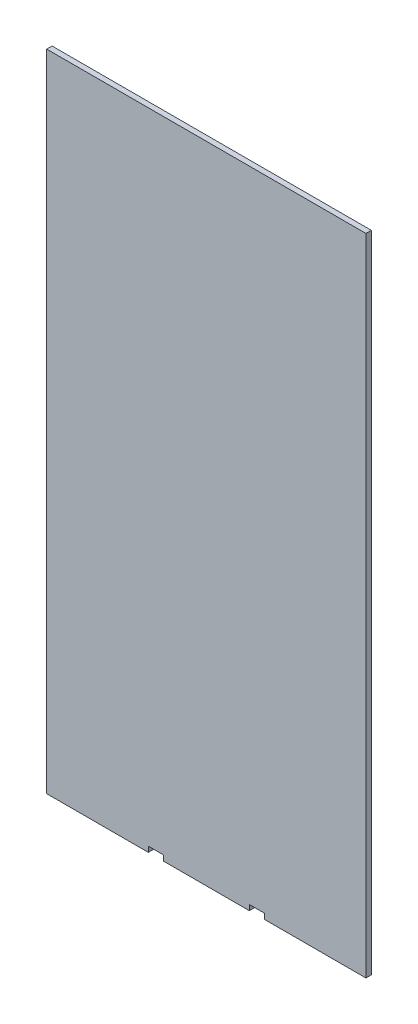
ISO-10303-21;
HEADER;
FILE_DESCRIPTION(('STEP AP214'),'2;1');
FILE_NAME('part.step','',(''),(''),'','','');
FILE_SCHEMA(('AUTOMOTIVE_DESIGN { 1 0 10303 214 1 1 1 1 }'));
ENDSEC;
DATA;
#1=APPLICATION_CONTEXT('core data for automotive mechanical design processes');
#2=APPLICATION_PROTOCOL_DEFINITION('international standard','automotive_design',2000,#1);
#3=PRODUCT_CONTEXT('',#1,'mechanical');
#4=PRODUCT('Part','Part','',(#3));
#5=PRODUCT_RELATED_PRODUCT_CATEGORY('part','',(#4));
#6=PRODUCT_DEFINITION_FORMATION('','',#4);
#7=PRODUCT_DEFINITION_CONTEXT('part definition',#1,'design');
#8=PRODUCT_DEFINITION('design','',#6,#7);
#9=PRODUCT_DEFINITION_SHAPE('','',#8);
#10=(LENGTH_UNIT() NAMED_UNIT(*) SI_UNIT(.MILLI.,.METRE.));
#11=(NAMED_UNIT(*) PLANE_ANGLE_UNIT() SI_UNIT($,.RADIAN.));
#12=(NAMED_UNIT(*) SI_UNIT($,.STERADIAN.) SOLID_ANGLE_UNIT());
#13=UNCERTAINTY_MEASURE_WITH_UNIT(LENGTH_MEASURE(1.E-05),#10,'distance_accuracy_value','');
#14=(GEOMETRIC_REPRESENTATION_CONTEXT(3) GLOBAL_UNCERTAINTY_ASSIGNED_CONTEXT((#13)) GLOBAL_UNIT_ASSIGNED_CONTEXT((#10,
#11,#12)) REPRESENTATION_CONTEXT('',''));
#15=CARTESIAN_POINT('',(0.,0.,0.));
#16=DIRECTION('',(0.,0.,1.));
#17=DIRECTION('',(1.,0.,0.));
#18=AXIS2_PLACEMENT_3D('',#15,#16,#17);
#19=CARTESIAN_POINT('',(-148.5,-607.,-5.));
#20=DIRECTION('',(0.,-1.,0.));
#21=DIRECTION('',(0.,0.,-1.));
#22=AXIS2_PLACEMENT_3D('',#19,#20,#21);
#23=PLANE('',#22);
#24=DIRECTION('',(0.,0.,-1.));
#25=VECTOR('',#24,1.);
#26=CARTESIAN_POINT('',(-40.,-607.,0.00100000000000013));
#27=LINE('',#26,#25);
#28=CARTESIAN_POINT('',(-40.,-607.,0.));
#29=VERTEX_POINT('',#28);
#30=CARTESIAN_POINT('',(-40.,-607.,-5.));
#31=VERTEX_POINT('',#30);
#32=EDGE_CURVE('E122',#29,#31,#27,.T.);
#33=ORIENTED_EDGE('',*,*,#32,.T.);
#34=DIRECTION('',(1.,0.,0.));
#35=VECTOR('',#34,1.);
#36=CARTESIAN_POINT('',(-148.5,-607.,-5.));
#37=LINE('',#36,#35);
#38=CARTESIAN_POINT('',(40.,-607.,-5.));
#39=VERTEX_POINT('',#38);
#40=EDGE_CURVE('E163',#31,#39,#37,.T.);
#41=ORIENTED_EDGE('',*,*,#40,.T.);
#42=DIRECTION('',(0.,0.,-1.));
#43=VECTOR('',#42,1.);
#44=CARTESIAN_POINT('',(40.,-607.,0.00100000000000013));
#45=LINE('',#44,#43);
#46=CARTESIAN_POINT('',(40.,-607.,0.));
#47=VERTEX_POINT('',#46);
#48=EDGE_CURVE('E143',#47,#39,#45,.T.);
#49=ORIENTED_EDGE('',*,*,#48,.F.);
#50=DIRECTION('',(1.,0.,0.));
#51=VECTOR('',#50,1.);
#52=CARTESIAN_POINT('',(-148.5,-607.,0.));
#53=LINE('',#52,#51);
#54=EDGE_CURVE('E137',#29,#47,#53,.T.);
#55=ORIENTED_EDGE('',*,*,#54,.F.);
#56=EDGE_LOOP('',(#33,#41,#49,#55));
#57=FACE_BOUND('',#56,.T.);
#58=ADVANCED_FACE('F31',(#57),#23,.T.);
#59=DIRECTION('',(0.,0.,-1.));
#60=VECTOR('',#59,1.);
#61=CARTESIAN_POINT('',(54.,-607.,0.00100000000000013));
#62=LINE('',#61,#60);
#63=CARTESIAN_POINT('',(54.,-607.,0.));
#64=VERTEX_POINT('',#63);
#65=CARTESIAN_POINT('',(54.,-607.,-5.));
#66=VERTEX_POINT('',#65);
#67=EDGE_CURVE('E183',#64,#66,#62,.T.);
#68=ORIENTED_EDGE('',*,*,#67,.T.);
#69=CARTESIAN_POINT('',(148.5,-607.,-5.));
#70=VERTEX_POINT('',#69);
#71=EDGE_CURVE('E165',#66,#70,#37,.T.);
#72=ORIENTED_EDGE('',*,*,#71,.T.);
#73=DIRECTION('',(0.,0.,1.));
#74=VECTOR('',#73,1.);
#75=CARTESIAN_POINT('',(148.5,-607.,-5.));
#76=LINE('',#75,#74);
#77=CARTESIAN_POINT('',(148.5,-607.,0.));
#78=VERTEX_POINT('',#77);
#79=EDGE_CURVE('E11',#70,#78,#76,.T.);
#80=ORIENTED_EDGE('',*,*,#79,.T.);
#81=EDGE_CURVE('E145',#64,#78,#53,.T.);
#82=ORIENTED_EDGE('',*,*,#81,.F.);
#83=EDGE_LOOP('',(#68,#72,#80,#82));
#84=FACE_BOUND('',#83,.T.);
#85=ADVANCED_FACE('F244',(#84),#23,.T.);
#86=CARTESIAN_POINT('',(148.5,-607.,-5.));
#87=DIRECTION('',(1.,0.,0.));
#88=DIRECTION('',(0.,0.,-1.));
#89=AXIS2_PLACEMENT_3D('',#86,#87,#88);
#90=PLANE('',#89);
#91=DIRECTION('',(0.,1.,0.));
#92=VECTOR('',#91,1.);
#93=CARTESIAN_POINT('',(148.5,-607.,0.));
#94=LINE('',#93,#92);
#95=CARTESIAN_POINT('',(148.5,-7.,0.));
#96=VERTEX_POINT('',#95);
#97=EDGE_CURVE('E191',#78,#96,#94,.T.);
#98=ORIENTED_EDGE('',*,*,#97,.F.);
#99=ORIENTED_EDGE('',*,*,#79,.F.);
#100=DIRECTION('',(0.,1.,0.));
#101=VECTOR('',#100,1.);
#102=CARTESIAN_POINT('',(148.5,-607.,-5.));
#103=LINE('',#102,#101);
#104=CARTESIAN_POINT('',(148.5,-7.,-5.));
#105=VERTEX_POINT('',#104);
#106=EDGE_CURVE('E148',#70,#105,#103,.T.);
#107=ORIENTED_EDGE('',*,*,#106,.T.);
#108=DIRECTION('',(0.,0.,1.));
#109=VECTOR('',#108,1.);
#110=CARTESIAN_POINT('',(148.5,-7.,-5.));
#111=LINE('',#110,#109);
#112=EDGE_CURVE('E35',#105,#96,#111,.T.);
#113=ORIENTED_EDGE('',*,*,#112,.T.);
#114=EDGE_LOOP('',(#98,#99,#107,#113));
#115=FACE_BOUND('',#114,.T.);
#116=ADVANCED_FACE('F33',(#115),#90,.T.);
#117=DIRECTION('',(0.,0.,-1.));
#118=VECTOR('',#117,1.);
#119=CARTESIAN_POINT('',(-54.,-607.,0.00100000000000013));
#120=LINE('',#119,#118);
#121=CARTESIAN_POINT('',(-54.,-607.,0.));
#122=VERTEX_POINT('',#121);
#123=CARTESIAN_POINT('',(-54.,-607.,-5.));
#124=VERTEX_POINT('',#123);
#125=EDGE_CURVE('E131',#122,#124,#120,.T.);
#126=ORIENTED_EDGE('',*,*,#125,.F.);
#127=CARTESIAN_POINT('',(-148.5,-607.,0.));
#128=VERTEX_POINT('',#127);
#129=EDGE_CURVE('E144',#128,#122,#53,.T.);
#130=ORIENTED_EDGE('',*,*,#129,.F.);
#131=DIRECTION('',(0.,0.,1.));
#132=VECTOR('',#131,1.);
#133=CARTESIAN_POINT('',(-148.5,-607.,-5.));
#134=LINE('',#133,#132);
#135=CARTESIAN_POINT('',(-148.5,-607.,-5.));
#136=VERTEX_POINT('',#135);
#137=EDGE_CURVE('E40',#136,#128,#134,.T.);
#138=ORIENTED_EDGE('',*,*,#137,.F.);
#139=EDGE_CURVE('E158',#136,#124,#37,.T.);
#140=ORIENTED_EDGE('',*,*,#139,.T.);
#141=EDGE_LOOP('',(#126,#130,#138,#140));
#142=FACE_BOUND('',#141,.T.);
#143=ADVANCED_FACE('F222',(#142),#23,.T.);
#144=CARTESIAN_POINT('',(-148.5,-607.,-5.));
#145=DIRECTION('',(-1.,0.,0.));
#146=DIRECTION('',(0.,0.,1.));
#147=AXIS2_PLACEMENT_3D('',#144,#145,#146);
#148=PLANE('',#147);
#149=DIRECTION('',(0.,-1.,0.));
#150=VECTOR('',#149,1.);
#151=CARTESIAN_POINT('',(-148.5,-607.,0.));
#152=LINE('',#151,#150);
#153=CARTESIAN_POINT('',(-148.5,-7.,0.));
#154=VERTEX_POINT('',#153);
#155=EDGE_CURVE('E149',#154,#128,#152,.T.);
#156=ORIENTED_EDGE('',*,*,#155,.F.);
#157=DIRECTION('',(0.,0.,1.));
#158=VECTOR('',#157,1.);
#159=CARTESIAN_POINT('',(-148.5,-7.,-5.));
#160=LINE('',#159,#158);
#161=CARTESIAN_POINT('',(-148.5,-7.,-5.));
#162=VERTEX_POINT('',#161);
#163=EDGE_CURVE('E153',#162,#154,#160,.T.);
#164=ORIENTED_EDGE('',*,*,#163,.F.);
#165=DIRECTION('',(0.,-1.,0.));
#166=VECTOR('',#165,1.);
#167=CARTESIAN_POINT('',(-148.5,-607.,-5.));
#168=LINE('',#167,#166);
#169=EDGE_CURVE('E171',#162,#136,#168,.T.);
#170=ORIENTED_EDGE('',*,*,#169,.T.);
#171=ORIENTED_EDGE('',*,*,#137,.T.);
#172=EDGE_LOOP('',(#156,#164,#170,#171));
#173=FACE_BOUND('',#172,.T.);
#174=ADVANCED_FACE('F236',(#173),#148,.T.);
#175=CARTESIAN_POINT('',(-148.5,-7.,-5.));
#176=DIRECTION('',(0.,1.,0.));
#177=DIRECTION('',(0.,0.,1.));
#178=AXIS2_PLACEMENT_3D('',#175,#176,#177);
#179=PLANE('',#178);
#180=DIRECTION('',(-1.,0.,0.));
#181=VECTOR('',#180,1.);
#182=CARTESIAN_POINT('',(-148.5,-7.,0.));
#183=LINE('',#182,#181);
#184=EDGE_CURVE('E226',#96,#154,#183,.T.);
#185=ORIENTED_EDGE('',*,*,#184,.F.);
#186=ORIENTED_EDGE('',*,*,#112,.F.);
#187=DIRECTION('',(-1.,0.,0.));
#188=VECTOR('',#187,1.);
#189=CARTESIAN_POINT('',(-148.5,-7.,-5.));
#190=LINE('',#189,#188);
#191=EDGE_CURVE('E177',#105,#162,#190,.T.);
#192=ORIENTED_EDGE('',*,*,#191,.T.);
#193=ORIENTED_EDGE('',*,*,#163,.T.);
#194=EDGE_LOOP('',(#185,#186,#192,#193));
#195=FACE_BOUND('',#194,.T.);
#196=ADVANCED_FACE('F234',(#195),#179,.T.);
#197=CARTESIAN_POINT('',(148.5,-7.,-5.));
#198=DIRECTION('',(0.,0.,-1.));
#199=DIRECTION('',(-1.,0.,0.));
#200=AXIS2_PLACEMENT_3D('',#197,#198,#199);
#201=PLANE('',#200);
#202=DIRECTION('',(0.,-1.,0.));
#203=VECTOR('',#202,1.);
#204=CARTESIAN_POINT('',(-40.,-607.,-5.));
#205=LINE('',#204,#203);
#206=CARTESIAN_POINT('',(-40.,-602.,-5.));
#207=VERTEX_POINT('',#206);
#208=EDGE_CURVE('E127',#207,#31,#205,.T.);
#209=ORIENTED_EDGE('',*,*,#208,.F.);
#210=DIRECTION('',(1.,0.,0.));
#211=VECTOR('',#210,1.);
#212=CARTESIAN_POINT('',(-40.,-602.,-5.));
#213=LINE('',#212,#211);
#214=CARTESIAN_POINT('',(-54.,-602.,-5.));
#215=VERTEX_POINT('',#214);
#216=EDGE_CURVE('E132',#215,#207,#213,.T.);
#217=ORIENTED_EDGE('',*,*,#216,.F.);
#218=DIRECTION('',(0.,1.,0.));
#219=VECTOR('',#218,1.);
#220=CARTESIAN_POINT('',(-54.,-607.,-5.));
#221=LINE('',#220,#219);
#222=EDGE_CURVE('E212',#124,#215,#221,.T.);
#223=ORIENTED_EDGE('',*,*,#222,.F.);
#224=ORIENTED_EDGE('',*,*,#139,.F.);
#225=ORIENTED_EDGE('',*,*,#169,.F.);
#226=ORIENTED_EDGE('',*,*,#191,.F.);
#227=ORIENTED_EDGE('',*,*,#106,.F.);
#228=ORIENTED_EDGE('',*,*,#71,.F.);
#229=DIRECTION('',(0.,-1.,0.));
#230=VECTOR('',#229,1.);
#231=CARTESIAN_POINT('',(54.,-607.,-5.));
#232=LINE('',#231,#230);
#233=CARTESIAN_POINT('',(54.,-602.,-5.));
#234=VERTEX_POINT('',#233);
#235=EDGE_CURVE('E197',#234,#66,#232,.T.);
#236=ORIENTED_EDGE('',*,*,#235,.F.);
#237=DIRECTION('',(1.,0.,0.));
#238=VECTOR('',#237,1.);
#239=CARTESIAN_POINT('',(54.,-602.,-5.));
#240=LINE('',#239,#238);
#241=CARTESIAN_POINT('',(40.,-602.,-5.));
#242=VERTEX_POINT('',#241);
#243=EDGE_CURVE('E185',#242,#234,#240,.T.);
#244=ORIENTED_EDGE('',*,*,#243,.F.);
#245=DIRECTION('',(0.,1.,0.));
#246=VECTOR('',#245,1.);
#247=CARTESIAN_POINT('',(40.,-607.,-5.));
#248=LINE('',#247,#246);
#249=EDGE_CURVE('E194',#39,#242,#248,.T.);
#250=ORIENTED_EDGE('',*,*,#249,.F.);
#251=ORIENTED_EDGE('',*,*,#40,.F.);
#252=EDGE_LOOP('',(#209,#217,#223,#224,#225,#226,#227,#228,#236,#244,#250,#251));
#253=FACE_BOUND('',#252,.T.);
#254=ADVANCED_FACE('F232',(#253),#201,.T.);
#255=CARTESIAN_POINT('',(148.5,-7.,0.));
#256=DIRECTION('',(0.,0.,-1.));
#257=DIRECTION('',(-1.,0.,0.));
#258=AXIS2_PLACEMENT_3D('',#255,#256,#257);
#259=PLANE('',#258);
#260=DIRECTION('',(-1.,0.,0.));
#261=VECTOR('',#260,1.);
#262=CARTESIAN_POINT('',(-40.,-602.,0.));
#263=LINE('',#262,#261);
#264=CARTESIAN_POINT('',(-40.,-602.,0.));
#265=VERTEX_POINT('',#264);
#266=CARTESIAN_POINT('',(-54.,-602.,0.));
#267=VERTEX_POINT('',#266);
#268=EDGE_CURVE('E48',#265,#267,#263,.T.);
#269=ORIENTED_EDGE('',*,*,#268,.F.);
#270=DIRECTION('',(0.,1.,0.));
#271=VECTOR('',#270,1.);
#272=CARTESIAN_POINT('',(-40.,-607.,0.));
#273=LINE('',#272,#271);
#274=EDGE_CURVE('E125',#29,#265,#273,.T.);
#275=ORIENTED_EDGE('',*,*,#274,.F.);
#276=ORIENTED_EDGE('',*,*,#54,.T.);
#277=DIRECTION('',(0.,-1.,0.));
#278=VECTOR('',#277,1.);
#279=CARTESIAN_POINT('',(40.,-607.,0.));
#280=LINE('',#279,#278);
#281=CARTESIAN_POINT('',(40.,-602.,0.));
#282=VERTEX_POINT('',#281);
#283=EDGE_CURVE('E203',#282,#47,#280,.T.);
#284=ORIENTED_EDGE('',*,*,#283,.F.);
#285=DIRECTION('',(-1.,0.,0.));
#286=VECTOR('',#285,1.);
#287=CARTESIAN_POINT('',(54.,-602.,0.));
#288=LINE('',#287,#286);
#289=CARTESIAN_POINT('',(54.,-602.,0.));
#290=VERTEX_POINT('',#289);
#291=EDGE_CURVE('E56',#290,#282,#288,.T.);
#292=ORIENTED_EDGE('',*,*,#291,.F.);
#293=DIRECTION('',(0.,1.,0.));
#294=VECTOR('',#293,1.);
#295=CARTESIAN_POINT('',(54.,-607.,0.));
#296=LINE('',#295,#294);
#297=EDGE_CURVE('E199',#64,#290,#296,.T.);
#298=ORIENTED_EDGE('',*,*,#297,.F.);
#299=ORIENTED_EDGE('',*,*,#81,.T.);
#300=ORIENTED_EDGE('',*,*,#97,.T.);
#301=ORIENTED_EDGE('',*,*,#184,.T.);
#302=ORIENTED_EDGE('',*,*,#155,.T.);
#303=ORIENTED_EDGE('',*,*,#129,.T.);
#304=DIRECTION('',(0.,-1.,0.));
#305=VECTOR('',#304,1.);
#306=CARTESIAN_POINT('',(-54.,-607.,0.));
#307=LINE('',#306,#305);
#308=EDGE_CURVE('E217',#267,#122,#307,.T.);
#309=ORIENTED_EDGE('',*,*,#308,.F.);
#310=EDGE_LOOP('',(#269,#275,#276,#284,#292,#298,#299,#300,#301,#302,#303,#309));
#311=FACE_BOUND('',#310,.T.);
#312=ADVANCED_FACE('F135',(#311),#259,.F.);
#313=CARTESIAN_POINT('',(54.,-607.,0.00100000000000013));
#314=DIRECTION('',(1.,0.,0.));
#315=DIRECTION('',(0.,0.,-1.));
#316=AXIS2_PLACEMENT_3D('',#313,#314,#315);
#317=PLANE('',#316);
#318=ORIENTED_EDGE('',*,*,#297,.T.);
#319=DIRECTION('',(0.,0.,-1.));
#320=VECTOR('',#319,1.);
#321=CARTESIAN_POINT('',(54.,-602.,0.00100000000000013));
#322=LINE('',#321,#320);
#323=EDGE_CURVE('E189',#290,#234,#322,.T.);
#324=ORIENTED_EDGE('',*,*,#323,.T.);
#325=ORIENTED_EDGE('',*,*,#235,.T.);
#326=ORIENTED_EDGE('',*,*,#67,.F.);
#327=EDGE_LOOP('',(#318,#324,#325,#326));
#328=FACE_BOUND('',#327,.T.);
#329=ADVANCED_FACE('F284',(#328),#317,.F.);
#330=CARTESIAN_POINT('',(54.,-602.,0.00100000000000013));
#331=DIRECTION('',(0.,1.,0.));
#332=DIRECTION('',(0.,0.,1.));
#333=AXIS2_PLACEMENT_3D('',#330,#331,#332);
#334=PLANE('',#333);
#335=ORIENTED_EDGE('',*,*,#291,.T.);
#336=DIRECTION('',(0.,0.,-1.));
#337=VECTOR('',#336,1.);
#338=CARTESIAN_POINT('',(40.,-602.,0.00100000000000013));
#339=LINE('',#338,#337);
#340=EDGE_CURVE('E187',#282,#242,#339,.T.);
#341=ORIENTED_EDGE('',*,*,#340,.T.);
#342=ORIENTED_EDGE('',*,*,#243,.T.);
#343=ORIENTED_EDGE('',*,*,#323,.F.);
#344=EDGE_LOOP('',(#335,#341,#342,#343));
#345=FACE_BOUND('',#344,.T.);
#346=ADVANCED_FACE('F292',(#345),#334,.F.);
#347=CARTESIAN_POINT('',(40.,-607.,0.00100000000000013));
#348=DIRECTION('',(-1.,0.,0.));
#349=DIRECTION('',(0.,0.,1.));
#350=AXIS2_PLACEMENT_3D('',#347,#348,#349);
#351=PLANE('',#350);
#352=ORIENTED_EDGE('',*,*,#283,.T.);
#353=ORIENTED_EDGE('',*,*,#48,.T.);
#354=ORIENTED_EDGE('',*,*,#249,.T.);
#355=ORIENTED_EDGE('',*,*,#340,.F.);
#356=EDGE_LOOP('',(#352,#353,#354,#355));
#357=FACE_BOUND('',#356,.T.);
#358=ADVANCED_FACE('F302',(#357),#351,.F.);
#359=CARTESIAN_POINT('',(-40.,-607.,0.00100000000000013));
#360=DIRECTION('',(1.,0.,0.));
#361=DIRECTION('',(0.,0.,-1.));
#362=AXIS2_PLACEMENT_3D('',#359,#360,#361);
#363=PLANE('',#362);
#364=ORIENTED_EDGE('',*,*,#274,.T.);
#365=DIRECTION('',(0.,0.,-1.));
#366=VECTOR('',#365,1.);
#367=CARTESIAN_POINT('',(-40.,-602.,0.00100000000000013));
#368=LINE('',#367,#366);
#369=EDGE_CURVE('E204',#265,#207,#368,.T.);
#370=ORIENTED_EDGE('',*,*,#369,.T.);
#371=ORIENTED_EDGE('',*,*,#208,.T.);
#372=ORIENTED_EDGE('',*,*,#32,.F.);
#373=EDGE_LOOP('',(#364,#370,#371,#372));
#374=FACE_BOUND('',#373,.T.);
#375=ADVANCED_FACE('F124',(#374),#363,.F.);
#376=CARTESIAN_POINT('',(-40.,-602.,0.00100000000000013));
#377=DIRECTION('',(0.,1.,0.));
#378=DIRECTION('',(0.,0.,1.));
#379=AXIS2_PLACEMENT_3D('',#376,#377,#378);
#380=PLANE('',#379);
#381=ORIENTED_EDGE('',*,*,#268,.T.);
#382=DIRECTION('',(0.,0.,-1.));
#383=VECTOR('',#382,1.);
#384=CARTESIAN_POINT('',(-54.,-602.,0.00100000000000013));
#385=LINE('',#384,#383);
#386=EDGE_CURVE('E207',#267,#215,#385,.T.);
#387=ORIENTED_EDGE('',*,*,#386,.T.);
#388=ORIENTED_EDGE('',*,*,#216,.T.);
#389=ORIENTED_EDGE('',*,*,#369,.F.);
#390=EDGE_LOOP('',(#381,#387,#388,#389));
#391=FACE_BOUND('',#390,.T.);
#392=ADVANCED_FACE('F320',(#391),#380,.F.);
#393=CARTESIAN_POINT('',(-54.,-607.,0.00100000000000013));
#394=DIRECTION('',(-1.,0.,0.));
#395=DIRECTION('',(0.,0.,1.));
#396=AXIS2_PLACEMENT_3D('',#393,#394,#395);
#397=PLANE('',#396);
#398=ORIENTED_EDGE('',*,*,#308,.T.);
#399=ORIENTED_EDGE('',*,*,#125,.T.);
#400=ORIENTED_EDGE('',*,*,#222,.T.);
#401=ORIENTED_EDGE('',*,*,#386,.F.);
#402=EDGE_LOOP('',(#398,#399,#400,#401));
#403=FACE_BOUND('',#402,.T.);
#404=ADVANCED_FACE('F219',(#403),#397,.F.);
#405=CLOSED_SHELL('',(#58,#85,#116,#143,#174,#196,#254,#312,#329,#346,#358,#375,#392,#404));
#406=MANIFOLD_SOLID_BREP('B2',#405);
#407=ADVANCED_BREP_SHAPE_REPRESENTATION('',(#18,#406),#14);
#408=SHAPE_DEFINITION_REPRESENTATION(#9,#407);
ENDSEC;
END-ISO-10303-21;
